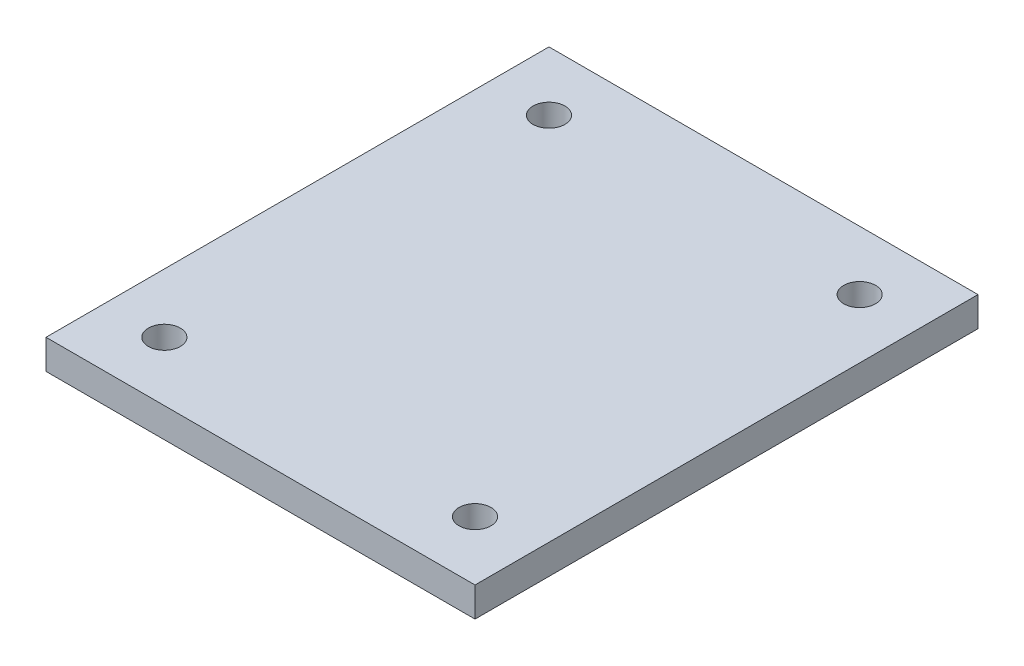
ISO-10303-21;
HEADER;
FILE_DESCRIPTION(('STEP AP214'),'2;1');
FILE_NAME('part.step','',(''),(''),'','','');
FILE_SCHEMA(('AUTOMOTIVE_DESIGN { 1 0 10303 214 1 1 1 1 }'));
ENDSEC;
DATA;
#1=APPLICATION_CONTEXT('core data for automotive mechanical design processes');
#2=APPLICATION_PROTOCOL_DEFINITION('international standard','automotive_design',2000,#1);
#3=PRODUCT_CONTEXT('',#1,'mechanical');
#4=PRODUCT('Part','Part','',(#3));
#5=PRODUCT_RELATED_PRODUCT_CATEGORY('part','',(#4));
#6=PRODUCT_DEFINITION_FORMATION('','',#4);
#7=PRODUCT_DEFINITION_CONTEXT('part definition',#1,'design');
#8=PRODUCT_DEFINITION('design','',#6,#7);
#9=PRODUCT_DEFINITION_SHAPE('','',#8);
#10=(LENGTH_UNIT() NAMED_UNIT(*) SI_UNIT(.MILLI.,.METRE.));
#11=(NAMED_UNIT(*) PLANE_ANGLE_UNIT() SI_UNIT($,.RADIAN.));
#12=(NAMED_UNIT(*) SI_UNIT($,.STERADIAN.) SOLID_ANGLE_UNIT());
#13=UNCERTAINTY_MEASURE_WITH_UNIT(LENGTH_MEASURE(1.E-05),#10,'distance_accuracy_value','');
#14=(GEOMETRIC_REPRESENTATION_CONTEXT(3) GLOBAL_UNCERTAINTY_ASSIGNED_CONTEXT((#13)) GLOBAL_UNIT_ASSIGNED_CONTEXT((#10,
#11,#12)) REPRESENTATION_CONTEXT('',''));
#15=CARTESIAN_POINT('',(0.,0.,0.));
#16=DIRECTION('',(0.,0.,1.));
#17=DIRECTION('',(1.,0.,0.));
#18=AXIS2_PLACEMENT_3D('',#15,#16,#17);
#19=CARTESIAN_POINT('',(46.0375,6.35,-53.975));
#20=DIRECTION('',(-1.,0.,0.));
#21=DIRECTION('',(0.,0.,1.));
#22=AXIS2_PLACEMENT_3D('',#19,#20,#21);
#23=PLANE('',#22);
#24=DIRECTION('',(0.,0.,-1.));
#25=VECTOR('',#24,1.);
#26=CARTESIAN_POINT('',(46.0375,0.,-53.975));
#27=LINE('',#26,#25);
#28=CARTESIAN_POINT('',(46.0375,0.,53.975));
#29=VERTEX_POINT('',#28);
#30=CARTESIAN_POINT('',(46.0375,0.,-53.975));
#31=VERTEX_POINT('',#30);
#32=EDGE_CURVE('E96',#29,#31,#27,.T.);
#33=ORIENTED_EDGE('',*,*,#32,.T.);
#34=DIRECTION('',(0.,-1.,0.));
#35=VECTOR('',#34,1.);
#36=CARTESIAN_POINT('',(46.0375,6.35,-53.975));
#37=LINE('',#36,#35);
#38=CARTESIAN_POINT('',(46.0375,6.35,-53.975));
#39=VERTEX_POINT('',#38);
#40=EDGE_CURVE('E11',#39,#31,#37,.T.);
#41=ORIENTED_EDGE('',*,*,#40,.F.);
#42=DIRECTION('',(0.,0.,-1.));
#43=VECTOR('',#42,1.);
#44=CARTESIAN_POINT('',(46.0375,6.35,-53.975));
#45=LINE('',#44,#43);
#46=CARTESIAN_POINT('',(46.0375,6.35,53.975));
#47=VERTEX_POINT('',#46);
#48=EDGE_CURVE('E84',#47,#39,#45,.T.);
#49=ORIENTED_EDGE('',*,*,#48,.F.);
#50=DIRECTION('',(0.,-1.,0.));
#51=VECTOR('',#50,1.);
#52=CARTESIAN_POINT('',(46.0375,6.35,53.975));
#53=LINE('',#52,#51);
#54=EDGE_CURVE('E92',#47,#29,#53,.T.);
#55=ORIENTED_EDGE('',*,*,#54,.T.);
#56=EDGE_LOOP('',(#33,#41,#49,#55));
#57=FACE_BOUND('',#56,.T.);
#58=ADVANCED_FACE('F33',(#57),#23,.F.);
#59=CARTESIAN_POINT('',(-46.0375,6.35,-53.975));
#60=DIRECTION('',(0.,0.,1.));
#61=DIRECTION('',(1.,0.,0.));
#62=AXIS2_PLACEMENT_3D('',#59,#60,#61);
#63=PLANE('',#62);
#64=DIRECTION('',(-1.,0.,0.));
#65=VECTOR('',#64,1.);
#66=CARTESIAN_POINT('',(-46.0375,0.,-53.975));
#67=LINE('',#66,#65);
#68=CARTESIAN_POINT('',(-46.0375,0.,-53.975));
#69=VERTEX_POINT('',#68);
#70=EDGE_CURVE('E88',#31,#69,#67,.T.);
#71=ORIENTED_EDGE('',*,*,#70,.T.);
#72=DIRECTION('',(0.,-1.,0.));
#73=VECTOR('',#72,1.);
#74=CARTESIAN_POINT('',(-46.0375,6.35,-53.975));
#75=LINE('',#74,#73);
#76=CARTESIAN_POINT('',(-46.0375,6.35,-53.975));
#77=VERTEX_POINT('',#76);
#78=EDGE_CURVE('E41',#77,#69,#75,.T.);
#79=ORIENTED_EDGE('',*,*,#78,.F.);
#80=DIRECTION('',(-1.,0.,0.));
#81=VECTOR('',#80,1.);
#82=CARTESIAN_POINT('',(-46.0375,6.35,-53.975));
#83=LINE('',#82,#81);
#84=EDGE_CURVE('E79',#39,#77,#83,.T.);
#85=ORIENTED_EDGE('',*,*,#84,.F.);
#86=ORIENTED_EDGE('',*,*,#40,.T.);
#87=EDGE_LOOP('',(#71,#79,#85,#86));
#88=FACE_BOUND('',#87,.T.);
#89=ADVANCED_FACE('F87',(#88),#63,.F.);
#90=CARTESIAN_POINT('',(-46.0375,6.35,-53.975));
#91=DIRECTION('',(1.,0.,0.));
#92=DIRECTION('',(0.,0.,-1.));
#93=AXIS2_PLACEMENT_3D('',#90,#91,#92);
#94=PLANE('',#93);
#95=DIRECTION('',(0.,0.,1.));
#96=VECTOR('',#95,1.);
#97=CARTESIAN_POINT('',(-46.0375,0.,-53.975));
#98=LINE('',#97,#96);
#99=CARTESIAN_POINT('',(-46.0375,0.,53.975));
#100=VERTEX_POINT('',#99);
#101=EDGE_CURVE('E66',#69,#100,#98,.T.);
#102=ORIENTED_EDGE('',*,*,#101,.T.);
#103=DIRECTION('',(0.,-1.,0.));
#104=VECTOR('',#103,1.);
#105=CARTESIAN_POINT('',(-46.0375,6.35,53.975));
#106=LINE('',#105,#104);
#107=CARTESIAN_POINT('',(-46.0375,6.35,53.975));
#108=VERTEX_POINT('',#107);
#109=EDGE_CURVE('E89',#108,#100,#106,.T.);
#110=ORIENTED_EDGE('',*,*,#109,.F.);
#111=DIRECTION('',(0.,0.,1.));
#112=VECTOR('',#111,1.);
#113=CARTESIAN_POINT('',(-46.0375,6.35,-53.975));
#114=LINE('',#113,#112);
#115=EDGE_CURVE('E82',#77,#108,#114,.T.);
#116=ORIENTED_EDGE('',*,*,#115,.F.);
#117=ORIENTED_EDGE('',*,*,#78,.T.);
#118=EDGE_LOOP('',(#102,#110,#116,#117));
#119=FACE_BOUND('',#118,.T.);
#120=ADVANCED_FACE('F90',(#119),#94,.F.);
#121=CARTESIAN_POINT('',(-46.0375,6.35,53.975));
#122=DIRECTION('',(0.,0.,-1.));
#123=DIRECTION('',(-1.,0.,0.));
#124=AXIS2_PLACEMENT_3D('',#121,#122,#123);
#125=PLANE('',#124);
#126=DIRECTION('',(1.,0.,0.));
#127=VECTOR('',#126,1.);
#128=CARTESIAN_POINT('',(-46.0375,0.,53.975));
#129=LINE('',#128,#127);
#130=EDGE_CURVE('E72',#100,#29,#129,.T.);
#131=ORIENTED_EDGE('',*,*,#130,.T.);
#132=ORIENTED_EDGE('',*,*,#54,.F.);
#133=DIRECTION('',(1.,0.,0.));
#134=VECTOR('',#133,1.);
#135=CARTESIAN_POINT('',(-46.0375,6.35,53.975));
#136=LINE('',#135,#134);
#137=EDGE_CURVE('E49',#108,#47,#136,.T.);
#138=ORIENTED_EDGE('',*,*,#137,.F.);
#139=ORIENTED_EDGE('',*,*,#109,.T.);
#140=EDGE_LOOP('',(#131,#132,#138,#139));
#141=FACE_BOUND('',#140,.T.);
#142=ADVANCED_FACE('F104',(#141),#125,.F.);
#143=CARTESIAN_POINT('',(0.,6.35,0.));
#144=DIRECTION('',(0.,1.,0.));
#145=DIRECTION('',(0.,0.,1.));
#146=AXIS2_PLACEMENT_3D('',#143,#144,#145);
#147=PLANE('',#146);
#148=CARTESIAN_POINT('',(33.3375,6.35,-41.275));
#149=DIRECTION('',(0.,1.,0.));
#150=DIRECTION('',(0.,0.,1.));
#151=AXIS2_PLACEMENT_3D('',#148,#149,#150);
#152=CIRCLE('',#151,3.42899999999999);
#153=CARTESIAN_POINT('',(33.3375,6.35,-37.846));
#154=VERTEX_POINT('',#153);
#155=EDGE_CURVE('E128',#154,#154,#152,.F.);
#156=ORIENTED_EDGE('',*,*,#155,.T.);
#157=EDGE_LOOP('',(#156));
#158=FACE_BOUND('',#157,.T.);
#159=CARTESIAN_POINT('',(33.3375,6.35,41.275));
#160=DIRECTION('',(0.,1.,0.));
#161=DIRECTION('',(0.,0.,1.));
#162=AXIS2_PLACEMENT_3D('',#159,#160,#161);
#163=CIRCLE('',#162,3.42899999999999);
#164=CARTESIAN_POINT('',(33.3375,6.35,44.704));
#165=VERTEX_POINT('',#164);
#166=EDGE_CURVE('E122',#165,#165,#163,.F.);
#167=ORIENTED_EDGE('',*,*,#166,.T.);
#168=EDGE_LOOP('',(#167));
#169=FACE_BOUND('',#168,.T.);
#170=CARTESIAN_POINT('',(-33.3375,6.35,-41.275));
#171=DIRECTION('',(0.,1.,0.));
#172=DIRECTION('',(0.,0.,1.));
#173=AXIS2_PLACEMENT_3D('',#170,#171,#172);
#174=CIRCLE('',#173,3.429);
#175=CARTESIAN_POINT('',(-33.3375,6.35,-37.846));
#176=VERTEX_POINT('',#175);
#177=EDGE_CURVE('E116',#176,#176,#174,.F.);
#178=ORIENTED_EDGE('',*,*,#177,.T.);
#179=EDGE_LOOP('',(#178));
#180=FACE_BOUND('',#179,.T.);
#181=CARTESIAN_POINT('',(-33.3375,6.35,41.275));
#182=DIRECTION('',(0.,1.,0.));
#183=DIRECTION('',(0.,0.,1.));
#184=AXIS2_PLACEMENT_3D('',#181,#182,#183);
#185=CIRCLE('',#184,3.429);
#186=CARTESIAN_POINT('',(-33.3375,6.35,44.704));
#187=VERTEX_POINT('',#186);
#188=EDGE_CURVE('E110',#187,#187,#185,.F.);
#189=ORIENTED_EDGE('',*,*,#188,.T.);
#190=EDGE_LOOP('',(#189));
#191=FACE_BOUND('',#190,.T.);
#192=ORIENTED_EDGE('',*,*,#48,.T.);
#193=ORIENTED_EDGE('',*,*,#84,.T.);
#194=ORIENTED_EDGE('',*,*,#115,.T.);
#195=ORIENTED_EDGE('',*,*,#137,.T.);
#196=EDGE_LOOP('',(#192,#193,#194,#195));
#197=FACE_BOUND('',#196,.T.);
#198=ADVANCED_FACE('F80',(#158,#169,#180,#191,#197),#147,.T.);
#199=CARTESIAN_POINT('',(0.,0.,0.));
#200=DIRECTION('',(0.,1.,0.));
#201=DIRECTION('',(0.,0.,1.));
#202=AXIS2_PLACEMENT_3D('',#199,#200,#201);
#203=PLANE('',#202);
#204=CARTESIAN_POINT('',(33.3375,0.,-41.275));
#205=DIRECTION('',(0.,-1.,0.));
#206=DIRECTION('',(0.,0.,-1.));
#207=AXIS2_PLACEMENT_3D('',#204,#205,#206);
#208=CIRCLE('',#207,3.42899999999999);
#209=CARTESIAN_POINT('',(33.3375,0.,-44.704));
#210=VERTEX_POINT('',#209);
#211=EDGE_CURVE('E125',#210,#210,#208,.T.);
#212=ORIENTED_EDGE('',*,*,#211,.F.);
#213=EDGE_LOOP('',(#212));
#214=FACE_BOUND('',#213,.T.);
#215=CARTESIAN_POINT('',(33.3375,0.,41.275));
#216=DIRECTION('',(0.,-1.,0.));
#217=DIRECTION('',(0.,0.,1.));
#218=AXIS2_PLACEMENT_3D('',#215,#216,#217);
#219=CIRCLE('',#218,3.42899999999999);
#220=CARTESIAN_POINT('',(33.3375,0.,44.704));
#221=VERTEX_POINT('',#220);
#222=EDGE_CURVE('E119',#221,#221,#219,.T.);
#223=ORIENTED_EDGE('',*,*,#222,.F.);
#224=EDGE_LOOP('',(#223));
#225=FACE_BOUND('',#224,.T.);
#226=CARTESIAN_POINT('',(-33.3375,0.,-41.275));
#227=DIRECTION('',(0.,-1.,0.));
#228=DIRECTION('',(0.,0.,1.));
#229=AXIS2_PLACEMENT_3D('',#226,#227,#228);
#230=CIRCLE('',#229,3.429);
#231=CARTESIAN_POINT('',(-33.3375,0.,-37.846));
#232=VERTEX_POINT('',#231);
#233=EDGE_CURVE('E113',#232,#232,#230,.T.);
#234=ORIENTED_EDGE('',*,*,#233,.F.);
#235=EDGE_LOOP('',(#234));
#236=FACE_BOUND('',#235,.T.);
#237=CARTESIAN_POINT('',(-33.3375,0.,41.275));
#238=DIRECTION('',(0.,-1.,0.));
#239=DIRECTION('',(0.,0.,-1.));
#240=AXIS2_PLACEMENT_3D('',#237,#238,#239);
#241=CIRCLE('',#240,3.429);
#242=CARTESIAN_POINT('',(-33.3375,0.,37.846));
#243=VERTEX_POINT('',#242);
#244=EDGE_CURVE('E99',#243,#243,#241,.T.);
#245=ORIENTED_EDGE('',*,*,#244,.F.);
#246=EDGE_LOOP('',(#245));
#247=FACE_BOUND('',#246,.T.);
#248=ORIENTED_EDGE('',*,*,#32,.F.);
#249=ORIENTED_EDGE('',*,*,#130,.F.);
#250=ORIENTED_EDGE('',*,*,#101,.F.);
#251=ORIENTED_EDGE('',*,*,#70,.F.);
#252=EDGE_LOOP('',(#248,#249,#250,#251));
#253=FACE_BOUND('',#252,.T.);
#254=ADVANCED_FACE('F107',(#214,#225,#236,#247,#253),#203,.F.);
#255=CARTESIAN_POINT('',(-33.3375,6.351,41.275));
#256=DIRECTION('',(0.,-1.,0.));
#257=DIRECTION('',(0.,0.,-1.));
#258=AXIS2_PLACEMENT_3D('',#255,#256,#257);
#259=CYLINDRICAL_SURFACE('',#258,3.429);
#260=ORIENTED_EDGE('',*,*,#188,.F.);
#261=EDGE_LOOP('',(#260));
#262=FACE_BOUND('',#261,.T.);
#263=ORIENTED_EDGE('',*,*,#244,.T.);
#264=EDGE_LOOP('',(#263));
#265=FACE_BOUND('',#264,.T.);
#266=ADVANCED_FACE('F138',(#262,#265),#259,.F.);
#267=CARTESIAN_POINT('',(-33.3375,6.351,-41.275));
#268=DIRECTION('',(0.,-1.,0.));
#269=DIRECTION('',(0.,0.,-1.));
#270=AXIS2_PLACEMENT_3D('',#267,#268,#269);
#271=CYLINDRICAL_SURFACE('',#270,3.429);
#272=ORIENTED_EDGE('',*,*,#177,.F.);
#273=EDGE_LOOP('',(#272));
#274=FACE_BOUND('',#273,.T.);
#275=ORIENTED_EDGE('',*,*,#233,.T.);
#276=EDGE_LOOP('',(#275));
#277=FACE_BOUND('',#276,.T.);
#278=ADVANCED_FACE('F147',(#274,#277),#271,.F.);
#279=CARTESIAN_POINT('',(33.3375,6.351,41.275));
#280=DIRECTION('',(0.,-1.,0.));
#281=DIRECTION('',(0.,0.,-1.));
#282=AXIS2_PLACEMENT_3D('',#279,#280,#281);
#283=CYLINDRICAL_SURFACE('',#282,3.42899999999999);
#284=ORIENTED_EDGE('',*,*,#166,.F.);
#285=EDGE_LOOP('',(#284));
#286=FACE_BOUND('',#285,.T.);
#287=ORIENTED_EDGE('',*,*,#222,.T.);
#288=EDGE_LOOP('',(#287));
#289=FACE_BOUND('',#288,.T.);
#290=ADVANCED_FACE('F153',(#286,#289),#283,.F.);
#291=CARTESIAN_POINT('',(33.3375,6.351,-41.275));
#292=DIRECTION('',(0.,-1.,0.));
#293=DIRECTION('',(0.,0.,-1.));
#294=AXIS2_PLACEMENT_3D('',#291,#292,#293);
#295=CYLINDRICAL_SURFACE('',#294,3.42899999999999);
#296=ORIENTED_EDGE('',*,*,#155,.F.);
#297=EDGE_LOOP('',(#296));
#298=FACE_BOUND('',#297,.T.);
#299=ORIENTED_EDGE('',*,*,#211,.T.);
#300=EDGE_LOOP('',(#299));
#301=FACE_BOUND('',#300,.T.);
#302=ADVANCED_FACE('F134',(#298,#301),#295,.F.);
#303=CLOSED_SHELL('',(#58,#89,#120,#142,#198,#254,#266,#278,#290,#302));
#304=MANIFOLD_SOLID_BREP('B2',#303);
#305=ADVANCED_BREP_SHAPE_REPRESENTATION('',(#18,#304),#14);
#306=SHAPE_DEFINITION_REPRESENTATION(#9,#305);
ENDSEC;
END-ISO-10303-21;
